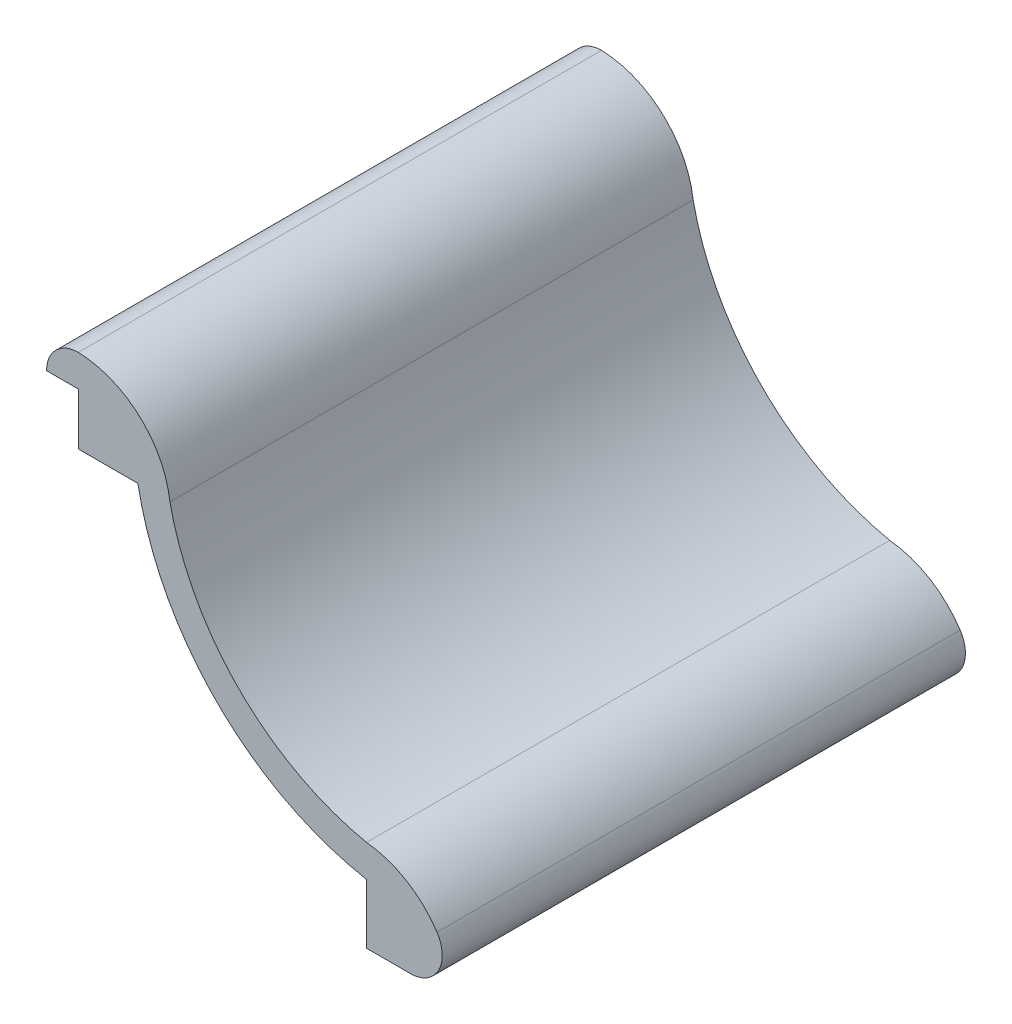
ISO-10303-21;
HEADER;
FILE_DESCRIPTION(('STEP AP214'),'2;1');
FILE_NAME('part.step','',(''),(''),'','','');
FILE_SCHEMA(('AUTOMOTIVE_DESIGN { 1 0 10303 214 1 1 1 1 }'));
ENDSEC;
DATA;
#1=APPLICATION_CONTEXT('core data for automotive mechanical design processes');
#2=APPLICATION_PROTOCOL_DEFINITION('international standard','automotive_design',2000,#1);
#3=PRODUCT_CONTEXT('',#1,'mechanical');
#4=PRODUCT('Part','Part','',(#3));
#5=PRODUCT_RELATED_PRODUCT_CATEGORY('part','',(#4));
#6=PRODUCT_DEFINITION_FORMATION('','',#4);
#7=PRODUCT_DEFINITION_CONTEXT('part definition',#1,'design');
#8=PRODUCT_DEFINITION('design','',#6,#7);
#9=PRODUCT_DEFINITION_SHAPE('','',#8);
#10=(LENGTH_UNIT() NAMED_UNIT(*) SI_UNIT(.MILLI.,.METRE.));
#11=(NAMED_UNIT(*) PLANE_ANGLE_UNIT() SI_UNIT($,.RADIAN.));
#12=(NAMED_UNIT(*) SI_UNIT($,.STERADIAN.) SOLID_ANGLE_UNIT());
#13=UNCERTAINTY_MEASURE_WITH_UNIT(LENGTH_MEASURE(1.E-05),#10,'distance_accuracy_value','');
#14=(GEOMETRIC_REPRESENTATION_CONTEXT(3) GLOBAL_UNCERTAINTY_ASSIGNED_CONTEXT((#13)) GLOBAL_UNIT_ASSIGNED_CONTEXT((#10,
#11,#12)) REPRESENTATION_CONTEXT('',''));
#15=CARTESIAN_POINT('',(0.,0.,0.));
#16=DIRECTION('',(0.,0.,1.));
#17=DIRECTION('',(1.,0.,0.));
#18=AXIS2_PLACEMENT_3D('',#15,#16,#17);
#19=CARTESIAN_POINT('',(-3.15197105507584,-11.938,-104.775));
#20=DIRECTION('',(0.,1.,0.));
#21=DIRECTION('',(0.,0.,1.));
#22=AXIS2_PLACEMENT_3D('',#19,#20,#21);
#23=PLANE('',#22);
#24=DIRECTION('',(-1.,0.,0.));
#25=VECTOR('',#24,1.);
#26=CARTESIAN_POINT('',(-3.15197105507584,-11.938,-104.775));
#27=LINE('',#26,#25);
#28=CARTESIAN_POINT('',(8.80657813501905,-11.938,-104.775));
#29=VERTEX_POINT('',#28);
#30=CARTESIAN_POINT('',(0.,-11.938,-104.775));
#31=VERTEX_POINT('',#30);
#32=EDGE_CURVE('E239',#29,#31,#27,.T.);
#33=ORIENTED_EDGE('',*,*,#32,.F.);
#34=DIRECTION('',(0.,0.,1.));
#35=VECTOR('',#34,1.);
#36=CARTESIAN_POINT('',(8.80657813501905,-11.938,0.));
#37=LINE('',#36,#35);
#38=CARTESIAN_POINT('',(8.80657813501905,-11.938,-98.9457));
#39=VERTEX_POINT('',#38);
#40=EDGE_CURVE('E331',#29,#39,#37,.T.);
#41=ORIENTED_EDGE('',*,*,#40,.T.);
#42=DIRECTION('',(1.,0.,0.));
#43=VECTOR('',#42,1.);
#44=CARTESIAN_POINT('',(-58.3144927056737,-11.938,-98.9457));
#45=LINE('',#44,#43);
#46=CARTESIAN_POINT('',(0.,-11.938,-98.9457));
#47=VERTEX_POINT('',#46);
#48=EDGE_CURVE('E248',#47,#39,#45,.T.);
#49=ORIENTED_EDGE('',*,*,#48,.F.);
#50=DIRECTION('',(0.,0.,-1.));
#51=VECTOR('',#50,1.);
#52=CARTESIAN_POINT('',(0.,-11.938,-76.0369258907853));
#53=LINE('',#52,#51);
#54=EDGE_CURVE('E251',#47,#31,#53,.T.);
#55=ORIENTED_EDGE('',*,*,#54,.T.);
#56=EDGE_LOOP('',(#33,#41,#49,#55));
#57=FACE_BOUND('',#56,.T.);
#58=ADVANCED_FACE('F60',(#57),#23,.F.);
#59=CARTESIAN_POINT('',(-57.7342,44.7636331488296,-104.775));
#60=DIRECTION('',(1.,0.,0.));
#61=DIRECTION('',(0.,0.,-1.));
#62=AXIS2_PLACEMENT_3D('',#59,#60,#61);
#63=PLANE('',#62);
#64=DIRECTION('',(0.,0.,1.));
#65=VECTOR('',#64,1.);
#66=CARTESIAN_POINT('',(-57.7342,56.197173041991,-104.775));
#67=LINE('',#66,#65);
#68=CARTESIAN_POINT('',(-57.7342,56.197173041991,-104.775));
#69=VERTEX_POINT('',#68);
#70=CARTESIAN_POINT('',(-57.7342,56.197173041991,-98.9457));
#71=VERTEX_POINT('',#70);
#72=EDGE_CURVE('E200',#69,#71,#67,.T.);
#73=ORIENTED_EDGE('',*,*,#72,.F.);
#74=DIRECTION('',(0.,1.,0.));
#75=VECTOR('',#74,1.);
#76=CARTESIAN_POINT('',(-57.7342,44.7636331488296,-104.775));
#77=LINE('',#76,#75);
#78=CARTESIAN_POINT('',(-57.7342,45.7961983303925,-104.775));
#79=VERTEX_POINT('',#78);
#80=EDGE_CURVE('E216',#79,#69,#77,.T.);
#81=ORIENTED_EDGE('',*,*,#80,.F.);
#82=DIRECTION('',(0.,0.,1.));
#83=VECTOR('',#82,1.);
#84=CARTESIAN_POINT('',(-57.7342,45.796198365176,-76.0369258907853));
#85=LINE('',#84,#83);
#86=CARTESIAN_POINT('',(-57.7342,45.796198295609,-98.9457));
#87=VERTEX_POINT('',#86);
#88=EDGE_CURVE('E265',#79,#87,#85,.T.);
#89=ORIENTED_EDGE('',*,*,#88,.T.);
#90=DIRECTION('',(0.,-1.,0.));
#91=VECTOR('',#90,1.);
#92=CARTESIAN_POINT('',(-57.7342,43.4795574980974,-98.9457));
#93=LINE('',#92,#91);
#94=EDGE_CURVE('E262',#71,#87,#93,.T.);
#95=ORIENTED_EDGE('',*,*,#94,.F.);
#96=EDGE_LOOP('',(#73,#81,#89,#95));
#97=FACE_BOUND('',#96,.T.);
#98=ADVANCED_FACE('F414',(#97),#63,.F.);
#99=CARTESIAN_POINT('',(-57.7342,56.197173041991,-92.5957));
#100=VERTEX_POINT('',#99);
#101=CARTESIAN_POINT('',(-57.7342,56.197173041991,0.));
#102=VERTEX_POINT('',#101);
#103=EDGE_CURVE('E328',#100,#102,#67,.T.);
#104=ORIENTED_EDGE('',*,*,#103,.F.);
#105=DIRECTION('',(0.,-1.,0.));
#106=VECTOR('',#105,1.);
#107=CARTESIAN_POINT('',(-57.7342,43.4795574980974,-92.5957));
#108=LINE('',#107,#106);
#109=CARTESIAN_POINT('',(-57.7342,45.796198295609,-92.5957));
#110=VERTEX_POINT('',#109);
#111=EDGE_CURVE('E256',#100,#110,#108,.T.);
#112=ORIENTED_EDGE('',*,*,#111,.T.);
#113=DIRECTION('',(0.,0.,-1.));
#114=VECTOR('',#113,1.);
#115=CARTESIAN_POINT('',(-57.7342,45.796198295609,92.5957));
#116=LINE('',#115,#114);
#117=CARTESIAN_POINT('',(-57.7342,45.796198295609,0.));
#118=VERTEX_POINT('',#117);
#119=EDGE_CURVE('E254',#118,#110,#116,.T.);
#120=ORIENTED_EDGE('',*,*,#119,.F.);
#121=DIRECTION('',(0.,-1.,0.));
#122=VECTOR('',#121,1.);
#123=CARTESIAN_POINT('',(-57.7342,44.7636331488296,0.));
#124=LINE('',#123,#122);
#125=EDGE_CURVE('E319',#102,#118,#124,.T.);
#126=ORIENTED_EDGE('',*,*,#125,.F.);
#127=EDGE_LOOP('',(#104,#112,#120,#126));
#128=FACE_BOUND('',#127,.T.);
#129=ADVANCED_FACE('F420',(#128),#63,.F.);
#130=CARTESIAN_POINT('',(10.3996216396257,56.1958216396257,104.775));
#131=DIRECTION('',(0.,0.,-1.));
#132=DIRECTION('',(-1.,0.,0.));
#133=AXIS2_PLACEMENT_3D('',#130,#131,#132);
#134=CYLINDRICAL_SURFACE('',#133,50.8493081391342);
#135=DIRECTION('',(0.,0.,-1.));
#136=VECTOR('',#135,1.);
#137=CARTESIAN_POINT('',(-39.3748698995276,45.7962,104.775));
#138=LINE('',#137,#136);
#139=CARTESIAN_POINT('',(-39.3748698995276,45.7962,0.));
#140=VERTEX_POINT('',#139);
#141=CARTESIAN_POINT('',(-39.3748698995276,45.7962,-104.775));
#142=VERTEX_POINT('',#141);
#143=EDGE_CURVE('E317',#140,#142,#138,.T.);
#144=ORIENTED_EDGE('',*,*,#143,.F.);
#145=CARTESIAN_POINT('',(10.3996216396257,56.1958216396257,0.));
#146=DIRECTION('',(0.,0.,1.));
#147=DIRECTION('',(1.,0.,0.));
#148=AXIS2_PLACEMENT_3D('',#145,#146,#147);
#149=CIRCLE('',#148,50.8493081391342);
#150=CARTESIAN_POINT('',(0.,6.42133010047239,0.));
#151=VERTEX_POINT('',#150);
#152=EDGE_CURVE('E229',#140,#151,#149,.T.);
#153=ORIENTED_EDGE('',*,*,#152,.T.);
#154=DIRECTION('',(0.,0.,-1.));
#155=VECTOR('',#154,1.);
#156=CARTESIAN_POINT('',(0.,6.42133010047239,104.775));
#157=LINE('',#156,#155);
#158=CARTESIAN_POINT('',(0.,6.42133010047239,-104.775));
#159=VERTEX_POINT('',#158);
#160=EDGE_CURVE('E316',#151,#159,#157,.T.);
#161=ORIENTED_EDGE('',*,*,#160,.T.);
#162=CARTESIAN_POINT('',(10.3996216396257,56.1958216396257,-104.775));
#163=DIRECTION('',(0.,0.,1.));
#164=DIRECTION('',(1.,0.,0.));
#165=AXIS2_PLACEMENT_3D('',#162,#163,#164);
#166=CIRCLE('',#165,50.8493081391342);
#167=EDGE_CURVE('E305',#142,#159,#166,.T.);
#168=ORIENTED_EDGE('',*,*,#167,.F.);
#169=EDGE_LOOP('',(#144,#153,#161,#168));
#170=FACE_BOUND('',#169,.T.);
#171=ADVANCED_FACE('F397',(#170),#134,.F.);
#172=CARTESIAN_POINT('',(-58.3144927056739,43.4795574980971,104.775));
#173=DIRECTION('',(0.,0.,-1.));
#174=DIRECTION('',(-1.,0.,0.));
#175=AXIS2_PLACEMENT_3D('',#172,#173,#174);
#176=CYLINDRICAL_SURFACE('',#175,19.0807794526513);
#177=DIRECTION('',(0.,0.,-1.));
#178=VECTOR('',#177,1.);
#179=CARTESIAN_POINT('',(-57.7342,62.5515108562736,104.775));
#180=LINE('',#179,#178);
#181=CARTESIAN_POINT('',(-57.7342,62.5515108562736,0.));
#182=VERTEX_POINT('',#181);
#183=CARTESIAN_POINT('',(-57.7342,62.5515108562736,-104.775));
#184=VERTEX_POINT('',#183);
#185=EDGE_CURVE('E267',#182,#184,#180,.T.);
#186=ORIENTED_EDGE('',*,*,#185,.F.);
#187=CARTESIAN_POINT('',(-58.3144927056739,43.4795574980971,0.));
#188=DIRECTION('',(0.,0.,1.));
#189=DIRECTION('',(1.,0.,0.));
#190=AXIS2_PLACEMENT_3D('',#187,#188,#189);
#191=CIRCLE('',#190,19.0807794526513);
#192=EDGE_CURVE('E226',#182,#140,#191,.F.);
#193=ORIENTED_EDGE('',*,*,#192,.T.);
#194=ORIENTED_EDGE('',*,*,#143,.T.);
#195=CARTESIAN_POINT('',(-58.3144927056739,43.4795574980971,-104.775));
#196=DIRECTION('',(0.,0.,-1.));
#197=DIRECTION('',(-1.,0.,0.));
#198=AXIS2_PLACEMENT_3D('',#195,#196,#197);
#199=CIRCLE('',#198,19.0807794526513);
#200=EDGE_CURVE('E313',#184,#142,#199,.T.);
#201=ORIENTED_EDGE('',*,*,#200,.F.);
#202=EDGE_LOOP('',(#186,#193,#194,#201));
#203=FACE_BOUND('',#202,.T.);
#204=ADVANCED_FACE('F393',(#203),#176,.T.);
#205=CARTESIAN_POINT('',(10.3996216396257,56.1958216396257,104.775));
#206=DIRECTION('',(0.,0.,-1.));
#207=DIRECTION('',(-1.,0.,0.));
#208=AXIS2_PLACEMENT_3D('',#205,#206,#207);
#209=CYLINDRICAL_SURFACE('',#208,57.15);
#210=DIRECTION('',(0.,0.,-1.));
#211=VECTOR('',#210,1.);
#212=CARTESIAN_POINT('',(0.,0.,92.5957));
#213=LINE('',#212,#211);
#214=CARTESIAN_POINT('',(0.,0.,0.));
#215=VERTEX_POINT('',#214);
#216=CARTESIAN_POINT('',(0.,0.,-92.5957));
#217=VERTEX_POINT('',#216);
#218=EDGE_CURVE('E294',#215,#217,#213,.T.);
#219=ORIENTED_EDGE('',*,*,#218,.F.);
#220=CARTESIAN_POINT('',(10.3996216396257,56.1958216396257,0.));
#221=DIRECTION('',(0.,0.,1.));
#222=DIRECTION('',(1.,0.,0.));
#223=AXIS2_PLACEMENT_3D('',#220,#221,#222);
#224=CIRCLE('',#223,57.15);
#225=CARTESIAN_POINT('',(-45.7961996845846,45.796198295609,0.));
#226=VERTEX_POINT('',#225);
#227=EDGE_CURVE('E219',#215,#226,#224,.F.);
#228=ORIENTED_EDGE('',*,*,#227,.T.);
#229=DIRECTION('',(0.,0.,-1.));
#230=VECTOR('',#229,1.);
#231=CARTESIAN_POINT('',(-45.7961996845846,45.796198295609,92.5957));
#232=LINE('',#231,#230);
#233=CARTESIAN_POINT('',(-45.7962,45.7962,-92.5957));
#234=VERTEX_POINT('',#233);
#235=EDGE_CURVE('E303',#226,#234,#232,.T.);
#236=ORIENTED_EDGE('',*,*,#235,.T.);
#237=DIRECTION('',(0.,0.,-1.));
#238=VECTOR('',#237,1.);
#239=CARTESIAN_POINT('',(-45.7962,45.7962,104.775));
#240=LINE('',#239,#238);
#241=CARTESIAN_POINT('',(-45.7962,45.7962,-98.9457));
#242=VERTEX_POINT('',#241);
#243=EDGE_CURVE('E320',#234,#242,#240,.T.);
#244=ORIENTED_EDGE('',*,*,#243,.T.);
#245=DIRECTION('',(0.,0.,-1.));
#246=VECTOR('',#245,1.);
#247=CARTESIAN_POINT('',(-45.7962,45.7962,-76.0369258907853));
#248=LINE('',#247,#246);
#249=CARTESIAN_POINT('',(-45.7962,45.7962,-104.775));
#250=VERTEX_POINT('',#249);
#251=EDGE_CURVE('E284',#242,#250,#248,.T.);
#252=ORIENTED_EDGE('',*,*,#251,.T.);
#253=CARTESIAN_POINT('',(10.3996216396257,56.1958216396257,-104.775));
#254=DIRECTION('',(0.,0.,-1.));
#255=DIRECTION('',(-1.,0.,0.));
#256=AXIS2_PLACEMENT_3D('',#253,#254,#255);
#257=CIRCLE('',#256,57.15);
#258=CARTESIAN_POINT('',(0.,0.,-104.775));
#259=VERTEX_POINT('',#258);
#260=EDGE_CURVE('E310',#259,#250,#257,.T.);
#261=ORIENTED_EDGE('',*,*,#260,.F.);
#262=DIRECTION('',(0.,0.,-1.));
#263=VECTOR('',#262,1.);
#264=CARTESIAN_POINT('',(0.,0.,-76.0369258907853));
#265=LINE('',#264,#263);
#266=CARTESIAN_POINT('',(0.,0.,-98.9457));
#267=VERTEX_POINT('',#266);
#268=EDGE_CURVE('E274',#267,#259,#265,.T.);
#269=ORIENTED_EDGE('',*,*,#268,.F.);
#270=DIRECTION('',(0.,0.,-1.));
#271=VECTOR('',#270,1.);
#272=CARTESIAN_POINT('',(0.,0.,104.775));
#273=LINE('',#272,#271);
#274=EDGE_CURVE('E323',#217,#267,#273,.T.);
#275=ORIENTED_EDGE('',*,*,#274,.F.);
#276=EDGE_LOOP('',(#219,#228,#236,#244,#252,#261,#269,#275));
#277=FACE_BOUND('',#276,.T.);
#278=ADVANCED_FACE('F369',(#277),#209,.T.);
#279=CARTESIAN_POINT('',(-1.87934056653368,-12.6385492205695,104.775));
#280=DIRECTION('',(0.,0.,-1.));
#281=DIRECTION('',(-1.,0.,0.));
#282=AXIS2_PLACEMENT_3D('',#279,#280,#281);
#283=CYLINDRICAL_SURFACE('',#282,19.1523084952624);
#284=CARTESIAN_POINT('',(-1.87934056653368,-12.6385492205695,0.));
#285=DIRECTION('',(0.,0.,1.));
#286=DIRECTION('',(1.,0.,0.));
#287=AXIS2_PLACEMENT_3D('',#284,#285,#286);
#288=CIRCLE('',#287,19.1523084952624);
#289=CARTESIAN_POINT('',(14.106839707373,-2.09089730424912,0.));
#290=VERTEX_POINT('',#289);
#291=EDGE_CURVE('E234',#151,#290,#288,.F.);
#292=ORIENTED_EDGE('',*,*,#291,.T.);
#293=DIRECTION('',(0.,0.,-1.));
#294=VECTOR('',#293,1.);
#295=CARTESIAN_POINT('',(14.106839707373,-2.09089730424912,104.775));
#296=LINE('',#295,#294);
#297=CARTESIAN_POINT('',(14.106839707373,-2.09089730424912,-104.775));
#298=VERTEX_POINT('',#297);
#299=EDGE_CURVE('E82',#290,#298,#296,.T.);
#300=ORIENTED_EDGE('',*,*,#299,.T.);
#301=CARTESIAN_POINT('',(-1.87934056653368,-12.6385492205695,-104.775));
#302=DIRECTION('',(0.,0.,-1.));
#303=DIRECTION('',(-1.,0.,0.));
#304=AXIS2_PLACEMENT_3D('',#301,#302,#303);
#305=CIRCLE('',#304,19.1523084952624);
#306=EDGE_CURVE('E308',#159,#298,#305,.T.);
#307=ORIENTED_EDGE('',*,*,#306,.F.);
#308=ORIENTED_EDGE('',*,*,#160,.F.);
#309=EDGE_LOOP('',(#292,#300,#307,#308));
#310=FACE_BOUND('',#309,.T.);
#311=ADVANCED_FACE('F399',(#310),#283,.T.);
#312=CARTESIAN_POINT('',(-58.2422,45.796198295609,92.5957));
#313=DIRECTION('',(0.,1.,0.));
#314=DIRECTION('',(-1.,0.,0.));
#315=AXIS2_PLACEMENT_3D('',#312,#313,#314);
#316=PLANE('',#315);
#317=DIRECTION('',(1.,0.,0.));
#318=VECTOR('',#317,1.);
#319=CARTESIAN_POINT('',(-58.2422,45.796198295609,0.));
#320=LINE('',#319,#318);
#321=EDGE_CURVE('E217',#118,#226,#320,.T.);
#322=ORIENTED_EDGE('',*,*,#321,.F.);
#323=ORIENTED_EDGE('',*,*,#119,.T.);
#324=DIRECTION('',(1.,0.,0.));
#325=VECTOR('',#324,1.);
#326=CARTESIAN_POINT('',(-58.2422,45.796198295609,-92.5957));
#327=LINE('',#326,#325);
#328=EDGE_CURVE('E300',#110,#234,#327,.T.);
#329=ORIENTED_EDGE('',*,*,#328,.T.);
#330=ORIENTED_EDGE('',*,*,#235,.F.);
#331=EDGE_LOOP('',(#322,#323,#329,#330));
#332=FACE_BOUND('',#331,.T.);
#333=ADVANCED_FACE('F401',(#332),#316,.F.);
#334=CARTESIAN_POINT('',(0.,0.,92.5957));
#335=DIRECTION('',(1.,0.,0.));
#336=DIRECTION('',(0.,1.,0.));
#337=AXIS2_PLACEMENT_3D('',#334,#335,#336);
#338=PLANE('',#337);
#339=DIRECTION('',(0.,-1.,0.));
#340=VECTOR('',#339,1.);
#341=CARTESIAN_POINT('',(0.,0.,0.));
#342=LINE('',#341,#340);
#343=CARTESIAN_POINT('',(0.,-11.938,0.));
#344=VERTEX_POINT('',#343);
#345=EDGE_CURVE('E232',#215,#344,#342,.T.);
#346=ORIENTED_EDGE('',*,*,#345,.F.);
#347=ORIENTED_EDGE('',*,*,#218,.T.);
#348=DIRECTION('',(0.,-1.,0.));
#349=VECTOR('',#348,1.);
#350=CARTESIAN_POINT('',(0.,0.,-92.5957));
#351=LINE('',#350,#349);
#352=CARTESIAN_POINT('',(0.,-11.938,-92.5957));
#353=VERTEX_POINT('',#352);
#354=EDGE_CURVE('E291',#217,#353,#351,.T.);
#355=ORIENTED_EDGE('',*,*,#354,.T.);
#356=DIRECTION('',(0.,0.,1.));
#357=VECTOR('',#356,1.);
#358=CARTESIAN_POINT('',(0.,-11.938,92.5957));
#359=LINE('',#358,#357);
#360=EDGE_CURVE('E241',#353,#344,#359,.T.);
#361=ORIENTED_EDGE('',*,*,#360,.T.);
#362=EDGE_LOOP('',(#346,#347,#355,#361));
#363=FACE_BOUND('',#362,.T.);
#364=ADVANCED_FACE('F407',(#363),#338,.F.);
#365=DIRECTION('',(1.,0.,0.));
#366=VECTOR('',#365,1.);
#367=CARTESIAN_POINT('',(-1.80789407603243,-11.938,-92.5957));
#368=LINE('',#367,#366);
#369=CARTESIAN_POINT('',(8.80657813501905,-11.938,-92.5957));
#370=VERTEX_POINT('',#369);
#371=EDGE_CURVE('E245',#353,#370,#368,.T.);
#372=ORIENTED_EDGE('',*,*,#371,.T.);
#373=DIRECTION('',(0.,0.,1.));
#374=VECTOR('',#373,1.);
#375=CARTESIAN_POINT('',(8.80657813501905,-11.938,0.));
#376=LINE('',#375,#374);
#377=CARTESIAN_POINT('',(8.80657813501905,-11.938,0.));
#378=VERTEX_POINT('',#377);
#379=EDGE_CURVE('E329',#370,#378,#376,.T.);
#380=ORIENTED_EDGE('',*,*,#379,.T.);
#381=DIRECTION('',(1.,0.,0.));
#382=VECTOR('',#381,1.);
#383=CARTESIAN_POINT('',(-3.15197105507584,-11.938,0.));
#384=LINE('',#383,#382);
#385=EDGE_CURVE('E236',#344,#378,#384,.T.);
#386=ORIENTED_EDGE('',*,*,#385,.F.);
#387=ORIENTED_EDGE('',*,*,#360,.F.);
#388=EDGE_LOOP('',(#372,#380,#386,#387));
#389=FACE_BOUND('',#388,.T.);
#390=ADVANCED_FACE('F416',(#389),#23,.F.);
#391=CARTESIAN_POINT('',(-1.80789407603234,-12.601825413661,104.775));
#392=DIRECTION('',(0.,0.,-1.));
#393=DIRECTION('',(-1.,0.,0.));
#394=AXIS2_PLACEMENT_3D('',#391,#392,#393);
#395=CYLINDRICAL_SURFACE('',#394,12.7308477622877);
#396=CARTESIAN_POINT('',(-1.80789407603252,-12.6018254136612,-98.9457));
#397=DIRECTION('',(0.,0.,-1.));
#398=DIRECTION('',(-1.,0.,0.));
#399=AXIS2_PLACEMENT_3D('',#396,#397,#398);
#400=CIRCLE('',#399,12.7308477622879);
#401=CARTESIAN_POINT('',(10.8826052233487,-11.589050868683,-98.9457));
#402=VERTEX_POINT('',#401);
#403=EDGE_CURVE('E273',#402,#267,#400,.F.);
#404=ORIENTED_EDGE('',*,*,#403,.F.);
#405=DIRECTION('',(0.,0.,-1.));
#406=VECTOR('',#405,1.);
#407=CARTESIAN_POINT('',(10.8826052233487,-11.589050868683,-98.9457));
#408=LINE('',#407,#406);
#409=CARTESIAN_POINT('',(10.8826052233487,-11.589050868683,-92.5957));
#410=VERTEX_POINT('',#409);
#411=EDGE_CURVE('E336',#402,#410,#408,.F.);
#412=ORIENTED_EDGE('',*,*,#411,.T.);
#413=CARTESIAN_POINT('',(-1.80789407603243,-12.6018254136611,-92.5957));
#414=DIRECTION('',(0.,0.,1.));
#415=DIRECTION('',(-1.,0.,0.));
#416=AXIS2_PLACEMENT_3D('',#413,#414,#415);
#417=CIRCLE('',#416,12.7308477622878);
#418=EDGE_CURVE('E289',#410,#217,#417,.T.);
#419=ORIENTED_EDGE('',*,*,#418,.T.);
#420=ORIENTED_EDGE('',*,*,#274,.T.);
#421=EDGE_LOOP('',(#404,#412,#419,#420));
#422=FACE_BOUND('',#421,.T.);
#423=ADVANCED_FACE('F360',(#422),#395,.F.);
#424=CARTESIAN_POINT('',(-58.3144927056739,43.4795574980971,104.775));
#425=DIRECTION('',(0.,0.,-1.));
#426=DIRECTION('',(-1.,0.,0.));
#427=AXIS2_PLACEMENT_3D('',#424,#425,#426);
#428=CYLINDRICAL_SURFACE('',#427,12.7308477622879);
#429=DIRECTION('',(0.,0.,-1.));
#430=VECTOR('',#429,1.);
#431=CARTESIAN_POINT('',(-57.7342,56.197173041991,104.775));
#432=LINE('',#431,#430);
#433=EDGE_CURVE('E259',#71,#100,#432,.F.);
#434=ORIENTED_EDGE('',*,*,#433,.F.);
#435=CARTESIAN_POINT('',(-58.3144927056736,43.4795574980973,-98.9457));
#436=DIRECTION('',(0.,0.,-1.));
#437=DIRECTION('',(-1.,0.,0.));
#438=AXIS2_PLACEMENT_3D('',#435,#436,#437);
#439=CIRCLE('',#438,12.7308477622876);
#440=EDGE_CURVE('E280',#242,#71,#439,.F.);
#441=ORIENTED_EDGE('',*,*,#440,.F.);
#442=ORIENTED_EDGE('',*,*,#243,.F.);
#443=CARTESIAN_POINT('',(-58.3144927056737,43.4795574980974,-92.5957));
#444=DIRECTION('',(0.,0.,1.));
#445=DIRECTION('',(-1.,0.,0.));
#446=AXIS2_PLACEMENT_3D('',#443,#444,#445);
#447=CIRCLE('',#446,12.7308477622876);
#448=EDGE_CURVE('E297',#234,#100,#447,.T.);
#449=ORIENTED_EDGE('',*,*,#448,.T.);
#450=EDGE_LOOP('',(#434,#441,#442,#449));
#451=FACE_BOUND('',#450,.T.);
#452=ADVANCED_FACE('F379',(#451),#428,.F.);
#453=CARTESIAN_POINT('',(10.3996216396257,56.1958216396257,-104.775));
#454=DIRECTION('',(0.,0.,1.));
#455=DIRECTION('',(1.,0.,0.));
#456=AXIS2_PLACEMENT_3D('',#453,#454,#455);
#457=PLANE('',#456);
#458=ORIENTED_EDGE('',*,*,#306,.T.);
#459=CARTESIAN_POINT('',(8.80657813501905,-5.588,-104.775));
#460=DIRECTION('',(0.,0.,1.));
#461=DIRECTION('',(1.,0.,0.));
#462=AXIS2_PLACEMENT_3D('',#459,#460,#461);
#463=CIRCLE('',#462,6.35);
#464=EDGE_CURVE('E68',#298,#29,#463,.F.);
#465=ORIENTED_EDGE('',*,*,#464,.T.);
#466=ORIENTED_EDGE('',*,*,#32,.T.);
#467=DIRECTION('',(0.,1.,0.));
#468=VECTOR('',#467,1.);
#469=CARTESIAN_POINT('',(0.,0.,-104.775));
#470=LINE('',#469,#468);
#471=EDGE_CURVE('E269',#31,#259,#470,.T.);
#472=ORIENTED_EDGE('',*,*,#471,.T.);
#473=ORIENTED_EDGE('',*,*,#260,.T.);
#474=DIRECTION('',(-0.999999999999991,-1.36942867347279E-07,0.));
#475=VECTOR('',#474,1.);
#476=CARTESIAN_POINT('',(-58.2422,45.796198295609,-104.775));
#477=LINE('',#476,#475);
#478=EDGE_CURVE('E276',#250,#79,#477,.T.);
#479=ORIENTED_EDGE('',*,*,#478,.T.);
#480=ORIENTED_EDGE('',*,*,#80,.T.);
#481=DIRECTION('',(1.,0.,0.));
#482=VECTOR('',#481,1.);
#483=CARTESIAN_POINT('',(-64.0842,56.197173041991,-104.775));
#484=LINE('',#483,#482);
#485=CARTESIAN_POINT('',(-64.0842,56.197173041991,-104.775));
#486=VERTEX_POINT('',#485);
#487=EDGE_CURVE('E206',#486,#69,#484,.T.);
#488=ORIENTED_EDGE('',*,*,#487,.F.);
#489=DIRECTION('',(0.,-1.,0.));
#490=VECTOR('',#489,1.);
#491=CARTESIAN_POINT('',(-64.0842,62.5515108562736,-104.775));
#492=LINE('',#491,#490);
#493=CARTESIAN_POINT('',(-64.0842,56.2015108562736,-104.775));
#494=VERTEX_POINT('',#493);
#495=EDGE_CURVE('E192',#494,#486,#492,.T.);
#496=ORIENTED_EDGE('',*,*,#495,.F.);
#497=CARTESIAN_POINT('',(-57.7342,56.2015108562736,-104.775));
#498=DIRECTION('',(0.,0.,1.));
#499=DIRECTION('',(1.,0.,0.));
#500=AXIS2_PLACEMENT_3D('',#497,#498,#499);
#501=CIRCLE('',#500,6.35);
#502=EDGE_CURVE('E75',#494,#184,#501,.F.);
#503=ORIENTED_EDGE('',*,*,#502,.T.);
#504=ORIENTED_EDGE('',*,*,#200,.T.);
#505=ORIENTED_EDGE('',*,*,#167,.T.);
#506=EDGE_LOOP('',(#458,#465,#466,#472,#473,#479,#480,#488,#496,#503,#504,#505));
#507=FACE_BOUND('',#506,.T.);
#508=ADVANCED_FACE('F214',(#507),#457,.F.);
#509=CARTESIAN_POINT('',(-58.3144927056737,43.4795574980974,-92.5957));
#510=DIRECTION('',(0.,0.,-1.));
#511=DIRECTION('',(-1.,0.,0.));
#512=AXIS2_PLACEMENT_3D('',#509,#510,#511);
#513=PLANE('',#512);
#514=ORIENTED_EDGE('',*,*,#111,.F.);
#515=ORIENTED_EDGE('',*,*,#448,.F.);
#516=ORIENTED_EDGE('',*,*,#328,.F.);
#517=EDGE_LOOP('',(#514,#515,#516));
#518=FACE_BOUND('',#517,.T.);
#519=ADVANCED_FACE('F440',(#518),#513,.T.);
#520=CARTESIAN_POINT('',(-1.80789407603243,-12.6018254136611,-92.5957));
#521=DIRECTION('',(0.,0.,-1.));
#522=DIRECTION('',(-1.,0.,0.));
#523=AXIS2_PLACEMENT_3D('',#520,#521,#522);
#524=PLANE('',#523);
#525=ORIENTED_EDGE('',*,*,#418,.F.);
#526=CARTESIAN_POINT('',(8.80657813501905,-5.588,-92.5957));
#527=DIRECTION('',(0.,0.,-1.));
#528=DIRECTION('',(-1.,0.,0.));
#529=AXIS2_PLACEMENT_3D('',#526,#527,#528);
#530=CIRCLE('',#529,6.35);
#531=EDGE_CURVE('E338',#410,#370,#530,.T.);
#532=ORIENTED_EDGE('',*,*,#531,.T.);
#533=ORIENTED_EDGE('',*,*,#371,.F.);
#534=ORIENTED_EDGE('',*,*,#354,.F.);
#535=EDGE_LOOP('',(#525,#532,#533,#534));
#536=FACE_BOUND('',#535,.T.);
#537=ADVANCED_FACE('F438',(#536),#524,.T.);
#538=CARTESIAN_POINT('',(-58.2422,45.796198295609,-76.0369258907853));
#539=DIRECTION('',(1.36942867347279E-07,-0.999999999999991,0.));
#540=DIRECTION('',(0.999999999999991,1.36942867347279E-07,0.));
#541=AXIS2_PLACEMENT_3D('',#538,#539,#540);
#542=PLANE('',#541);
#543=ORIENTED_EDGE('',*,*,#88,.F.);
#544=ORIENTED_EDGE('',*,*,#478,.F.);
#545=ORIENTED_EDGE('',*,*,#251,.F.);
#546=DIRECTION('',(0.999999999999991,1.36942867347279E-07,0.));
#547=VECTOR('',#546,1.);
#548=CARTESIAN_POINT('',(-58.2422,45.796198295609,-98.9457));
#549=LINE('',#548,#547);
#550=EDGE_CURVE('E283',#87,#242,#549,.T.);
#551=ORIENTED_EDGE('',*,*,#550,.F.);
#552=EDGE_LOOP('',(#543,#544,#545,#551));
#553=FACE_BOUND('',#552,.T.);
#554=ADVANCED_FACE('F376',(#553),#542,.T.);
#555=CARTESIAN_POINT('',(-58.3144927056737,43.4795574980974,-98.9457));
#556=DIRECTION('',(0.,0.,-1.));
#557=DIRECTION('',(-1.,0.,0.));
#558=AXIS2_PLACEMENT_3D('',#555,#556,#557);
#559=PLANE('',#558);
#560=ORIENTED_EDGE('',*,*,#440,.T.);
#561=ORIENTED_EDGE('',*,*,#94,.T.);
#562=ORIENTED_EDGE('',*,*,#550,.T.);
#563=EDGE_LOOP('',(#560,#561,#562));
#564=FACE_BOUND('',#563,.T.);
#565=ADVANCED_FACE('F381',(#564),#559,.F.);
#566=CARTESIAN_POINT('',(0.,0.,-76.0369258907853));
#567=DIRECTION('',(-1.,0.,0.));
#568=DIRECTION('',(0.,-1.,0.));
#569=AXIS2_PLACEMENT_3D('',#566,#567,#568);
#570=PLANE('',#569);
#571=ORIENTED_EDGE('',*,*,#54,.F.);
#572=DIRECTION('',(0.,-1.,0.));
#573=VECTOR('',#572,1.);
#574=CARTESIAN_POINT('',(0.,0.,-98.9457));
#575=LINE('',#574,#573);
#576=EDGE_CURVE('E270',#267,#47,#575,.T.);
#577=ORIENTED_EDGE('',*,*,#576,.F.);
#578=ORIENTED_EDGE('',*,*,#268,.T.);
#579=ORIENTED_EDGE('',*,*,#471,.F.);
#580=EDGE_LOOP('',(#571,#577,#578,#579));
#581=FACE_BOUND('',#580,.T.);
#582=ADVANCED_FACE('F367',(#581),#570,.T.);
#583=CARTESIAN_POINT('',(-58.3144927056737,43.4795574980974,-98.9457));
#584=DIRECTION('',(0.,0.,-1.));
#585=DIRECTION('',(-1.,0.,0.));
#586=AXIS2_PLACEMENT_3D('',#583,#584,#585);
#587=PLANE('',#586);
#588=ORIENTED_EDGE('',*,*,#48,.T.);
#589=CARTESIAN_POINT('',(8.80657813501905,-5.588,-98.9457));
#590=DIRECTION('',(0.,0.,-1.));
#591=DIRECTION('',(-1.,0.,0.));
#592=AXIS2_PLACEMENT_3D('',#589,#590,#591);
#593=CIRCLE('',#592,6.35);
#594=EDGE_CURVE('E334',#39,#402,#593,.F.);
#595=ORIENTED_EDGE('',*,*,#594,.T.);
#596=ORIENTED_EDGE('',*,*,#403,.T.);
#597=ORIENTED_EDGE('',*,*,#576,.T.);
#598=EDGE_LOOP('',(#588,#595,#596,#597));
#599=FACE_BOUND('',#598,.T.);
#600=ADVANCED_FACE('F357',(#599),#587,.F.);
#601=CARTESIAN_POINT('',(0.,0.,0.));
#602=DIRECTION('',(0.,0.,1.));
#603=DIRECTION('',(1.,0.,0.));
#604=AXIS2_PLACEMENT_3D('',#601,#602,#603);
#605=PLANE('',#604);
#606=ORIENTED_EDGE('',*,*,#385,.T.);
#607=CARTESIAN_POINT('',(8.80657813501905,-5.588,0.));
#608=DIRECTION('',(0.,0.,1.));
#609=DIRECTION('',(1.,0.,0.));
#610=AXIS2_PLACEMENT_3D('',#607,#608,#609);
#611=CIRCLE('',#610,6.35);
#612=EDGE_CURVE('E342',#378,#290,#611,.T.);
#613=ORIENTED_EDGE('',*,*,#612,.T.);
#614=ORIENTED_EDGE('',*,*,#291,.F.);
#615=ORIENTED_EDGE('',*,*,#152,.F.);
#616=ORIENTED_EDGE('',*,*,#192,.F.);
#617=CARTESIAN_POINT('',(-57.7342,56.2015108562736,0.));
#618=DIRECTION('',(0.,0.,1.));
#619=DIRECTION('',(1.,0.,0.));
#620=AXIS2_PLACEMENT_3D('',#617,#618,#619);
#621=CIRCLE('',#620,6.35);
#622=CARTESIAN_POINT('',(-64.0842,56.2015108562736,0.));
#623=VERTEX_POINT('',#622);
#624=EDGE_CURVE('E340',#182,#623,#621,.T.);
#625=ORIENTED_EDGE('',*,*,#624,.T.);
#626=DIRECTION('',(0.,1.,0.));
#627=VECTOR('',#626,1.);
#628=CARTESIAN_POINT('',(-64.0842,62.5515108562736,0.));
#629=LINE('',#628,#627);
#630=CARTESIAN_POINT('',(-64.0842,56.197173041991,0.));
#631=VERTEX_POINT('',#630);
#632=EDGE_CURVE('E211',#631,#623,#629,.T.);
#633=ORIENTED_EDGE('',*,*,#632,.F.);
#634=DIRECTION('',(1.,0.,0.));
#635=VECTOR('',#634,1.);
#636=CARTESIAN_POINT('',(-64.0842,56.197173041991,0.));
#637=LINE('',#636,#635);
#638=EDGE_CURVE('E209',#631,#102,#637,.T.);
#639=ORIENTED_EDGE('',*,*,#638,.T.);
#640=ORIENTED_EDGE('',*,*,#125,.T.);
#641=ORIENTED_EDGE('',*,*,#321,.T.);
#642=ORIENTED_EDGE('',*,*,#227,.F.);
#643=ORIENTED_EDGE('',*,*,#345,.T.);
#644=EDGE_LOOP('',(#606,#613,#614,#615,#616,#625,#633,#639,#640,#641,#642,#643));
#645=FACE_BOUND('',#644,.T.);
#646=ADVANCED_FACE('F387',(#645),#605,.T.);
#647=CARTESIAN_POINT('',(-64.0842,56.197173041991,-104.775));
#648=DIRECTION('',(0.,1.,0.));
#649=DIRECTION('',(0.,0.,1.));
#650=AXIS2_PLACEMENT_3D('',#647,#648,#649);
#651=PLANE('',#650);
#652=ORIENTED_EDGE('',*,*,#72,.T.);
#653=ORIENTED_EDGE('',*,*,#433,.T.);
#654=ORIENTED_EDGE('',*,*,#103,.T.);
#655=ORIENTED_EDGE('',*,*,#638,.F.);
#656=DIRECTION('',(0.,0.,1.));
#657=VECTOR('',#656,1.);
#658=CARTESIAN_POINT('',(-64.0842,56.197173041991,-104.775));
#659=LINE('',#658,#657);
#660=EDGE_CURVE('E196',#486,#631,#659,.T.);
#661=ORIENTED_EDGE('',*,*,#660,.F.);
#662=ORIENTED_EDGE('',*,*,#487,.T.);
#663=EDGE_LOOP('',(#652,#653,#654,#655,#661,#662));
#664=FACE_BOUND('',#663,.T.);
#665=ADVANCED_FACE('F205',(#664),#651,.F.);
#666=CARTESIAN_POINT('',(-64.0842,0.,0.));
#667=DIRECTION('',(-1.,0.,0.));
#668=DIRECTION('',(0.,0.,1.));
#669=AXIS2_PLACEMENT_3D('',#666,#667,#668);
#670=PLANE('',#669);
#671=ORIENTED_EDGE('',*,*,#632,.T.);
#672=DIRECTION('',(0.,0.,-1.));
#673=VECTOR('',#672,1.);
#674=CARTESIAN_POINT('',(-64.0842,56.2015108562736,-104.775));
#675=LINE('',#674,#673);
#676=EDGE_CURVE('E15',#623,#494,#675,.T.);
#677=ORIENTED_EDGE('',*,*,#676,.T.);
#678=ORIENTED_EDGE('',*,*,#495,.T.);
#679=ORIENTED_EDGE('',*,*,#660,.T.);
#680=EDGE_LOOP('',(#671,#677,#678,#679));
#681=FACE_BOUND('',#680,.T.);
#682=ADVANCED_FACE('F195',(#681),#670,.T.);
#683=CARTESIAN_POINT('',(8.80657813501905,-5.588,104.775));
#684=DIRECTION('',(0.,0.,-1.));
#685=DIRECTION('',(-1.,0.,0.));
#686=AXIS2_PLACEMENT_3D('',#683,#684,#685);
#687=CYLINDRICAL_SURFACE('',#686,6.35);
#688=ORIENTED_EDGE('',*,*,#464,.F.);
#689=ORIENTED_EDGE('',*,*,#299,.F.);
#690=ORIENTED_EDGE('',*,*,#612,.F.);
#691=ORIENTED_EDGE('',*,*,#379,.F.);
#692=ORIENTED_EDGE('',*,*,#531,.F.);
#693=ORIENTED_EDGE('',*,*,#411,.F.);
#694=ORIENTED_EDGE('',*,*,#594,.F.);
#695=ORIENTED_EDGE('',*,*,#40,.F.);
#696=EDGE_LOOP('',(#688,#689,#690,#691,#692,#693,#694,#695));
#697=FACE_BOUND('',#696,.T.);
#698=ADVANCED_FACE('F352',(#697),#687,.T.);
#699=CARTESIAN_POINT('',(-57.7342,56.2015108562736,0.));
#700=DIRECTION('',(0.,0.,1.));
#701=DIRECTION('',(1.,0.,0.));
#702=AXIS2_PLACEMENT_3D('',#699,#700,#701);
#703=CYLINDRICAL_SURFACE('',#702,6.35);
#704=ORIENTED_EDGE('',*,*,#624,.F.);
#705=ORIENTED_EDGE('',*,*,#185,.T.);
#706=ORIENTED_EDGE('',*,*,#502,.F.);
#707=ORIENTED_EDGE('',*,*,#676,.F.);
#708=EDGE_LOOP('',(#704,#705,#706,#707));
#709=FACE_BOUND('',#708,.T.);
#710=ADVANCED_FACE('F62',(#709),#703,.T.);
#711=CLOSED_SHELL('',(#58,#98,#129,#171,#204,#278,#311,#333,#364,#390,#423,#452,#508,#519,#537,
#554,#565,#582,#600,#646,#665,#682,#698,#710));
#712=MANIFOLD_SOLID_BREP('B2',#711);
#713=ADVANCED_BREP_SHAPE_REPRESENTATION('',(#18,#712),#14);
#714=SHAPE_DEFINITION_REPRESENTATION(#9,#713);
ENDSEC;
END-ISO-10303-21;
